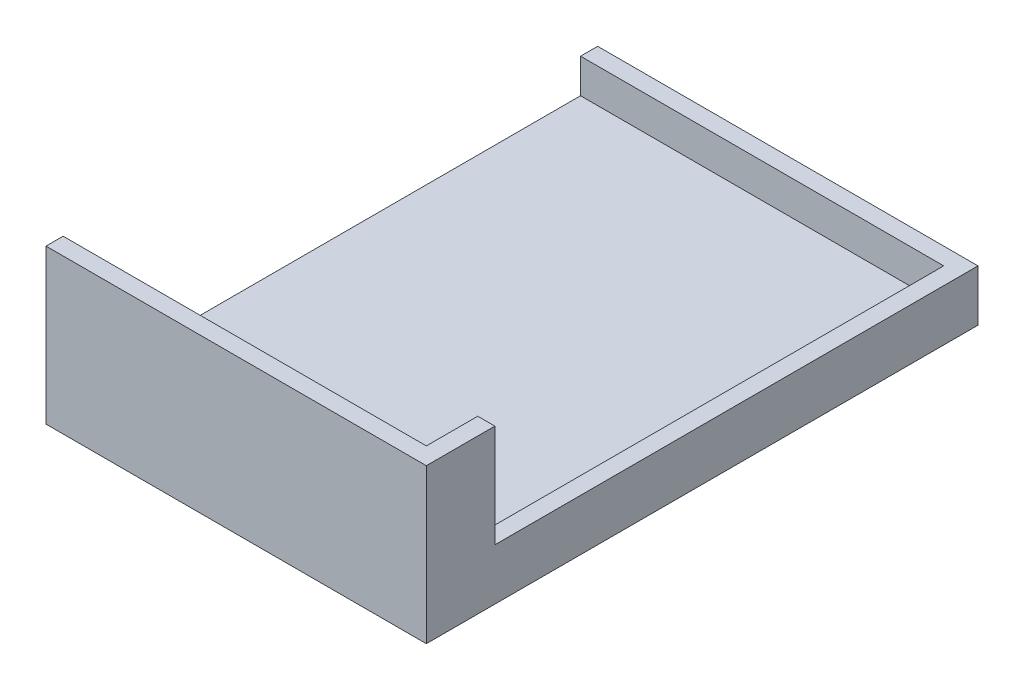
ISO-10303-21;
HEADER;
FILE_DESCRIPTION(('STEP AP214'),'2;1');
FILE_NAME('part.step','',(''),(''),'','','');
FILE_SCHEMA(('AUTOMOTIVE_DESIGN { 1 0 10303 214 1 1 1 1 }'));
ENDSEC;
DATA;
#1=APPLICATION_CONTEXT('core data for automotive mechanical design processes');
#2=APPLICATION_PROTOCOL_DEFINITION('international standard','automotive_design',2000,#1);
#3=PRODUCT_CONTEXT('',#1,'mechanical');
#4=PRODUCT('Part','Part','',(#3));
#5=PRODUCT_RELATED_PRODUCT_CATEGORY('part','',(#4));
#6=PRODUCT_DEFINITION_FORMATION('','',#4);
#7=PRODUCT_DEFINITION_CONTEXT('part definition',#1,'design');
#8=PRODUCT_DEFINITION('design','',#6,#7);
#9=PRODUCT_DEFINITION_SHAPE('','',#8);
#10=(LENGTH_UNIT() NAMED_UNIT(*) SI_UNIT(.MILLI.,.METRE.));
#11=(NAMED_UNIT(*) PLANE_ANGLE_UNIT() SI_UNIT($,.RADIAN.));
#12=(NAMED_UNIT(*) SI_UNIT($,.STERADIAN.) SOLID_ANGLE_UNIT());
#13=UNCERTAINTY_MEASURE_WITH_UNIT(LENGTH_MEASURE(1.E-05),#10,'distance_accuracy_value','');
#14=(GEOMETRIC_REPRESENTATION_CONTEXT(3) GLOBAL_UNCERTAINTY_ASSIGNED_CONTEXT((#13)) GLOBAL_UNIT_ASSIGNED_CONTEXT((#10,
#11,#12)) REPRESENTATION_CONTEXT('',''));
#15=CARTESIAN_POINT('',(0.,0.,0.));
#16=DIRECTION('',(0.,0.,1.));
#17=DIRECTION('',(1.,0.,0.));
#18=AXIS2_PLACEMENT_3D('',#15,#16,#17);
#19=CARTESIAN_POINT('',(0.,28.575,0.));
#20=DIRECTION('',(0.,-1.,0.));
#21=DIRECTION('',(0.,0.,-1.));
#22=AXIS2_PLACEMENT_3D('',#19,#20,#21);
#23=PLANE('',#22);
#24=DIRECTION('',(0.,0.,-1.));
#25=VECTOR('',#24,1.);
#26=CARTESIAN_POINT('',(35.675,28.575,51.06));
#27=LINE('',#26,#25);
#28=CARTESIAN_POINT('',(35.675,28.575,51.06));
#29=VERTEX_POINT('',#28);
#30=CARTESIAN_POINT('',(35.675,28.575,38.36));
#31=VERTEX_POINT('',#30);
#32=EDGE_CURVE('E97',#29,#31,#27,.T.);
#33=ORIENTED_EDGE('',*,*,#32,.T.);
#34=DIRECTION('',(1.,0.,0.));
#35=VECTOR('',#34,1.);
#36=CARTESIAN_POINT('',(-59.0391649787128,28.575,38.36));
#37=LINE('',#36,#35);
#38=CARTESIAN_POINT('',(32.5,28.575,38.36));
#39=VERTEX_POINT('',#38);
#40=EDGE_CURVE('E194',#39,#31,#37,.T.);
#41=ORIENTED_EDGE('',*,*,#40,.F.);
#42=DIRECTION('',(0.,0.,-1.));
#43=VECTOR('',#42,1.);
#44=CARTESIAN_POINT('',(32.5,28.575,0.));
#45=LINE('',#44,#43);
#46=CARTESIAN_POINT('',(32.5,28.575,47.885));
#47=VERTEX_POINT('',#46);
#48=EDGE_CURVE('E182',#47,#39,#45,.T.);
#49=ORIENTED_EDGE('',*,*,#48,.F.);
#50=DIRECTION('',(1.,0.,0.));
#51=VECTOR('',#50,1.);
#52=CARTESIAN_POINT('',(0.,28.575,47.885));
#53=LINE('',#52,#51);
#54=CARTESIAN_POINT('',(-34.81,28.575,47.885));
#55=VERTEX_POINT('',#54);
#56=EDGE_CURVE('E174',#55,#47,#53,.T.);
#57=ORIENTED_EDGE('',*,*,#56,.F.);
#58=DIRECTION('',(0.,0.,1.));
#59=VECTOR('',#58,1.);
#60=CARTESIAN_POINT('',(-34.81,28.575,51.06));
#61=LINE('',#60,#59);
#62=CARTESIAN_POINT('',(-34.81,28.575,51.06));
#63=VERTEX_POINT('',#62);
#64=EDGE_CURVE('E211',#55,#63,#61,.T.);
#65=ORIENTED_EDGE('',*,*,#64,.T.);
#66=DIRECTION('',(1.,0.,0.));
#67=VECTOR('',#66,1.);
#68=CARTESIAN_POINT('',(-34.81,28.575,51.06));
#69=LINE('',#68,#67);
#70=EDGE_CURVE('E68',#63,#29,#69,.T.);
#71=ORIENTED_EDGE('',*,*,#70,.T.);
#72=EDGE_LOOP('',(#33,#41,#49,#57,#65,#71));
#73=FACE_BOUND('',#72,.T.);
#74=ADVANCED_FACE('F43',(#73),#23,.F.);
#75=CARTESIAN_POINT('',(35.675,28.575,51.06));
#76=DIRECTION('',(-1.,0.,0.));
#77=DIRECTION('',(0.,0.,1.));
#78=AXIS2_PLACEMENT_3D('',#75,#76,#77);
#79=PLANE('',#78);
#80=DIRECTION('',(0.,-1.,0.));
#81=VECTOR('',#80,1.);
#82=CARTESIAN_POINT('',(35.675,28.575,-51.175));
#83=LINE('',#82,#81);
#84=CARTESIAN_POINT('',(35.675,9.525,-51.175));
#85=VERTEX_POINT('',#84);
#86=CARTESIAN_POINT('',(35.675,0.,-51.175));
#87=VERTEX_POINT('',#86);
#88=EDGE_CURVE('E11',#85,#87,#83,.T.);
#89=ORIENTED_EDGE('',*,*,#88,.F.);
#90=DIRECTION('',(0.,0.,-1.));
#91=VECTOR('',#90,1.);
#92=CARTESIAN_POINT('',(35.675,9.525,38.36));
#93=LINE('',#92,#91);
#94=CARTESIAN_POINT('',(35.675,9.525,38.36));
#95=VERTEX_POINT('',#94);
#96=EDGE_CURVE('E144',#95,#85,#93,.T.);
#97=ORIENTED_EDGE('',*,*,#96,.F.);
#98=DIRECTION('',(0.,-1.,0.));
#99=VECTOR('',#98,1.);
#100=CARTESIAN_POINT('',(35.675,28.575,38.36));
#101=LINE('',#100,#99);
#102=EDGE_CURVE('E239',#31,#95,#101,.T.);
#103=ORIENTED_EDGE('',*,*,#102,.F.);
#104=ORIENTED_EDGE('',*,*,#32,.F.);
#105=DIRECTION('',(0.,-1.,0.));
#106=VECTOR('',#105,1.);
#107=CARTESIAN_POINT('',(35.675,28.575,51.06));
#108=LINE('',#107,#106);
#109=CARTESIAN_POINT('',(35.675,0.,51.06));
#110=VERTEX_POINT('',#109);
#111=EDGE_CURVE('E89',#29,#110,#108,.T.);
#112=ORIENTED_EDGE('',*,*,#111,.T.);
#113=DIRECTION('',(0.,0.,-1.));
#114=VECTOR('',#113,1.);
#115=CARTESIAN_POINT('',(35.675,0.,51.06));
#116=LINE('',#115,#114);
#117=EDGE_CURVE('E103',#110,#87,#116,.T.);
#118=ORIENTED_EDGE('',*,*,#117,.T.);
#119=EDGE_LOOP('',(#89,#97,#103,#104,#112,#118));
#120=FACE_BOUND('',#119,.T.);
#121=ADVANCED_FACE('F45',(#120),#79,.F.);
#122=CARTESIAN_POINT('',(-34.81,28.575,-51.175));
#123=DIRECTION('',(0.,0.,1.));
#124=DIRECTION('',(1.,0.,0.));
#125=AXIS2_PLACEMENT_3D('',#122,#123,#124);
#126=PLANE('',#125);
#127=DIRECTION('',(0.,-1.,0.));
#128=VECTOR('',#127,1.);
#129=CARTESIAN_POINT('',(-34.81,28.575,-51.175));
#130=LINE('',#129,#128);
#131=CARTESIAN_POINT('',(-34.81,9.525,-51.175));
#132=VERTEX_POINT('',#131);
#133=CARTESIAN_POINT('',(-34.81,0.,-51.175));
#134=VERTEX_POINT('',#133);
#135=EDGE_CURVE('E52',#132,#134,#130,.T.);
#136=ORIENTED_EDGE('',*,*,#135,.F.);
#137=DIRECTION('',(1.,0.,0.));
#138=VECTOR('',#137,1.);
#139=CARTESIAN_POINT('',(-59.0391649787128,9.525,-51.175));
#140=LINE('',#139,#138);
#141=EDGE_CURVE('E140',#132,#85,#140,.T.);
#142=ORIENTED_EDGE('',*,*,#141,.T.);
#143=ORIENTED_EDGE('',*,*,#88,.T.);
#144=DIRECTION('',(-1.,0.,0.));
#145=VECTOR('',#144,1.);
#146=CARTESIAN_POINT('',(-34.81,0.,-51.175));
#147=LINE('',#146,#145);
#148=EDGE_CURVE('E110',#87,#134,#147,.T.);
#149=ORIENTED_EDGE('',*,*,#148,.T.);
#150=EDGE_LOOP('',(#136,#142,#143,#149));
#151=FACE_BOUND('',#150,.T.);
#152=ADVANCED_FACE('F137',(#151),#126,.F.);
#153=CARTESIAN_POINT('',(-34.81,28.575,51.06));
#154=DIRECTION('',(1.,0.,0.));
#155=DIRECTION('',(0.,0.,-1.));
#156=AXIS2_PLACEMENT_3D('',#153,#154,#155);
#157=PLANE('',#156);
#158=DIRECTION('',(0.,-1.,0.));
#159=VECTOR('',#158,1.);
#160=CARTESIAN_POINT('',(-34.81,28.575,-48.));
#161=LINE('',#160,#159);
#162=CARTESIAN_POINT('',(-34.81,9.525,-48.));
#163=VERTEX_POINT('',#162);
#164=CARTESIAN_POINT('',(-34.81,3.175,-48.));
#165=VERTEX_POINT('',#164);
#166=EDGE_CURVE('E118',#163,#165,#161,.T.);
#167=ORIENTED_EDGE('',*,*,#166,.F.);
#168=DIRECTION('',(0.,0.,-1.));
#169=VECTOR('',#168,1.);
#170=CARTESIAN_POINT('',(-34.81,9.525,21.9538319179157));
#171=LINE('',#170,#169);
#172=EDGE_CURVE('E134',#163,#132,#171,.T.);
#173=ORIENTED_EDGE('',*,*,#172,.T.);
#174=ORIENTED_EDGE('',*,*,#135,.T.);
#175=DIRECTION('',(0.,0.,1.));
#176=VECTOR('',#175,1.);
#177=CARTESIAN_POINT('',(-34.81,0.,51.06));
#178=LINE('',#177,#176);
#179=CARTESIAN_POINT('',(-34.81,0.,51.06));
#180=VERTEX_POINT('',#179);
#181=EDGE_CURVE('E98',#134,#180,#178,.T.);
#182=ORIENTED_EDGE('',*,*,#181,.T.);
#183=DIRECTION('',(0.,-1.,0.));
#184=VECTOR('',#183,1.);
#185=CARTESIAN_POINT('',(-34.81,28.575,51.06));
#186=LINE('',#185,#184);
#187=EDGE_CURVE('E92',#63,#180,#186,.T.);
#188=ORIENTED_EDGE('',*,*,#187,.F.);
#189=ORIENTED_EDGE('',*,*,#64,.F.);
#190=DIRECTION('',(0.,-1.,0.));
#191=VECTOR('',#190,1.);
#192=CARTESIAN_POINT('',(-34.81,28.575,47.885));
#193=LINE('',#192,#191);
#194=CARTESIAN_POINT('',(-34.81,3.175,47.885));
#195=VERTEX_POINT('',#194);
#196=EDGE_CURVE('E59',#55,#195,#193,.T.);
#197=ORIENTED_EDGE('',*,*,#196,.T.);
#198=DIRECTION('',(0.,0.,1.));
#199=VECTOR('',#198,1.);
#200=CARTESIAN_POINT('',(-34.81,3.175,0.));
#201=LINE('',#200,#199);
#202=EDGE_CURVE('E199',#165,#195,#201,.T.);
#203=ORIENTED_EDGE('',*,*,#202,.F.);
#204=EDGE_LOOP('',(#167,#173,#174,#182,#188,#189,#197,#203));
#205=FACE_BOUND('',#204,.T.);
#206=ADVANCED_FACE('F131',(#205),#157,.F.);
#207=CARTESIAN_POINT('',(-34.81,28.575,51.06));
#208=DIRECTION('',(0.,0.,-1.));
#209=DIRECTION('',(-1.,0.,0.));
#210=AXIS2_PLACEMENT_3D('',#207,#208,#209);
#211=PLANE('',#210);
#212=DIRECTION('',(1.,0.,0.));
#213=VECTOR('',#212,1.);
#214=CARTESIAN_POINT('',(-34.81,0.,51.06));
#215=LINE('',#214,#213);
#216=EDGE_CURVE('E86',#180,#110,#215,.T.);
#217=ORIENTED_EDGE('',*,*,#216,.T.);
#218=ORIENTED_EDGE('',*,*,#111,.F.);
#219=ORIENTED_EDGE('',*,*,#70,.F.);
#220=ORIENTED_EDGE('',*,*,#187,.T.);
#221=EDGE_LOOP('',(#217,#218,#219,#220));
#222=FACE_BOUND('',#221,.T.);
#223=ADVANCED_FACE('F88',(#222),#211,.F.);
#224=CARTESIAN_POINT('',(0.,0.,0.));
#225=DIRECTION('',(0.,-1.,0.));
#226=DIRECTION('',(0.,0.,-1.));
#227=AXIS2_PLACEMENT_3D('',#224,#225,#226);
#228=PLANE('',#227);
#229=ORIENTED_EDGE('',*,*,#117,.F.);
#230=ORIENTED_EDGE('',*,*,#216,.F.);
#231=ORIENTED_EDGE('',*,*,#181,.F.);
#232=ORIENTED_EDGE('',*,*,#148,.F.);
#233=EDGE_LOOP('',(#229,#230,#231,#232));
#234=FACE_BOUND('',#233,.T.);
#235=ADVANCED_FACE('F108',(#234),#228,.T.);
#236=CARTESIAN_POINT('',(32.5,28.575,51.06));
#237=DIRECTION('',(-1.,0.,0.));
#238=DIRECTION('',(0.,0.,1.));
#239=AXIS2_PLACEMENT_3D('',#236,#237,#238);
#240=PLANE('',#239);
#241=DIRECTION('',(0.,0.,-1.));
#242=VECTOR('',#241,1.);
#243=CARTESIAN_POINT('',(32.5,9.525,38.36));
#244=LINE('',#243,#242);
#245=CARTESIAN_POINT('',(32.5,9.525,38.36));
#246=VERTEX_POINT('',#245);
#247=CARTESIAN_POINT('',(32.5,9.525,-48.));
#248=VERTEX_POINT('',#247);
#249=EDGE_CURVE('E232',#246,#248,#244,.T.);
#250=ORIENTED_EDGE('',*,*,#249,.T.);
#251=DIRECTION('',(0.,-1.,0.));
#252=VECTOR('',#251,1.);
#253=CARTESIAN_POINT('',(32.5,28.575,-48.));
#254=LINE('',#253,#252);
#255=CARTESIAN_POINT('',(32.5,3.175,-48.));
#256=VERTEX_POINT('',#255);
#257=EDGE_CURVE('E112',#248,#256,#254,.T.);
#258=ORIENTED_EDGE('',*,*,#257,.T.);
#259=DIRECTION('',(0.,0.,-1.));
#260=VECTOR('',#259,1.);
#261=CARTESIAN_POINT('',(32.5,3.175,0.));
#262=LINE('',#261,#260);
#263=CARTESIAN_POINT('',(32.5,3.175,47.885));
#264=VERTEX_POINT('',#263);
#265=EDGE_CURVE('E190',#264,#256,#262,.T.);
#266=ORIENTED_EDGE('',*,*,#265,.F.);
#267=DIRECTION('',(0.,-1.,0.));
#268=VECTOR('',#267,1.);
#269=CARTESIAN_POINT('',(32.5,28.575,47.885));
#270=LINE('',#269,#268);
#271=EDGE_CURVE('E177',#47,#264,#270,.T.);
#272=ORIENTED_EDGE('',*,*,#271,.F.);
#273=ORIENTED_EDGE('',*,*,#48,.T.);
#274=DIRECTION('',(0.,-1.,0.));
#275=VECTOR('',#274,1.);
#276=CARTESIAN_POINT('',(32.5,28.575,38.36));
#277=LINE('',#276,#275);
#278=EDGE_CURVE('E229',#39,#246,#277,.T.);
#279=ORIENTED_EDGE('',*,*,#278,.T.);
#280=EDGE_LOOP('',(#250,#258,#266,#272,#273,#279));
#281=FACE_BOUND('',#280,.T.);
#282=ADVANCED_FACE('F187',(#281),#240,.T.);
#283=CARTESIAN_POINT('',(-34.81,28.575,-48.));
#284=DIRECTION('',(0.,0.,1.));
#285=DIRECTION('',(1.,0.,0.));
#286=AXIS2_PLACEMENT_3D('',#283,#284,#285);
#287=PLANE('',#286);
#288=DIRECTION('',(-1.,0.,0.));
#289=VECTOR('',#288,1.);
#290=CARTESIAN_POINT('',(-34.81,9.525,-48.));
#291=LINE('',#290,#289);
#292=EDGE_CURVE('E247',#248,#163,#291,.T.);
#293=ORIENTED_EDGE('',*,*,#292,.T.);
#294=ORIENTED_EDGE('',*,*,#166,.T.);
#295=DIRECTION('',(-1.,0.,0.));
#296=VECTOR('',#295,1.);
#297=CARTESIAN_POINT('',(0.,3.175,-48.));
#298=LINE('',#297,#296);
#299=EDGE_CURVE('E207',#256,#165,#298,.T.);
#300=ORIENTED_EDGE('',*,*,#299,.F.);
#301=ORIENTED_EDGE('',*,*,#257,.F.);
#302=EDGE_LOOP('',(#293,#294,#300,#301));
#303=FACE_BOUND('',#302,.T.);
#304=ADVANCED_FACE('F250',(#303),#287,.T.);
#305=CARTESIAN_POINT('',(-34.81,28.575,47.885));
#306=DIRECTION('',(0.,0.,-1.));
#307=DIRECTION('',(-1.,0.,0.));
#308=AXIS2_PLACEMENT_3D('',#305,#306,#307);
#309=PLANE('',#308);
#310=DIRECTION('',(1.,0.,0.));
#311=VECTOR('',#310,1.);
#312=CARTESIAN_POINT('',(0.,3.175,47.885));
#313=LINE('',#312,#311);
#314=EDGE_CURVE('E196',#195,#264,#313,.T.);
#315=ORIENTED_EDGE('',*,*,#314,.F.);
#316=ORIENTED_EDGE('',*,*,#196,.F.);
#317=ORIENTED_EDGE('',*,*,#56,.T.);
#318=ORIENTED_EDGE('',*,*,#271,.T.);
#319=EDGE_LOOP('',(#315,#316,#317,#318));
#320=FACE_BOUND('',#319,.T.);
#321=ADVANCED_FACE('F176',(#320),#309,.T.);
#322=CARTESIAN_POINT('',(0.,3.175,0.));
#323=DIRECTION('',(0.,-1.,0.));
#324=DIRECTION('',(0.,0.,-1.));
#325=AXIS2_PLACEMENT_3D('',#322,#323,#324);
#326=PLANE('',#325);
#327=ORIENTED_EDGE('',*,*,#265,.T.);
#328=ORIENTED_EDGE('',*,*,#299,.T.);
#329=ORIENTED_EDGE('',*,*,#202,.T.);
#330=ORIENTED_EDGE('',*,*,#314,.T.);
#331=EDGE_LOOP('',(#327,#328,#329,#330));
#332=FACE_BOUND('',#331,.T.);
#333=ADVANCED_FACE('F218',(#332),#326,.F.);
#334=CARTESIAN_POINT('',(-59.0391649787128,9.525,38.36));
#335=DIRECTION('',(0.,-1.,0.));
#336=DIRECTION('',(0.,0.,-1.));
#337=AXIS2_PLACEMENT_3D('',#334,#335,#336);
#338=PLANE('',#337);
#339=DIRECTION('',(1.,0.,0.));
#340=VECTOR('',#339,1.);
#341=CARTESIAN_POINT('',(-59.0391649787128,9.525,38.36));
#342=LINE('',#341,#340);
#343=EDGE_CURVE('E224',#246,#95,#342,.T.);
#344=ORIENTED_EDGE('',*,*,#343,.T.);
#345=ORIENTED_EDGE('',*,*,#96,.T.);
#346=ORIENTED_EDGE('',*,*,#141,.F.);
#347=ORIENTED_EDGE('',*,*,#172,.F.);
#348=ORIENTED_EDGE('',*,*,#292,.F.);
#349=ORIENTED_EDGE('',*,*,#249,.F.);
#350=EDGE_LOOP('',(#344,#345,#346,#347,#348,#349));
#351=FACE_BOUND('',#350,.T.);
#352=ADVANCED_FACE('F251',(#351),#338,.F.);
#353=CARTESIAN_POINT('',(-59.0391649787128,28.575,38.36));
#354=DIRECTION('',(0.,0.,1.));
#355=DIRECTION('',(1.,0.,0.));
#356=AXIS2_PLACEMENT_3D('',#353,#354,#355);
#357=PLANE('',#356);
#358=ORIENTED_EDGE('',*,*,#40,.T.);
#359=ORIENTED_EDGE('',*,*,#102,.T.);
#360=ORIENTED_EDGE('',*,*,#343,.F.);
#361=ORIENTED_EDGE('',*,*,#278,.F.);
#362=EDGE_LOOP('',(#358,#359,#360,#361));
#363=FACE_BOUND('',#362,.T.);
#364=ADVANCED_FACE('F254',(#363),#357,.F.);
#365=CLOSED_SHELL('',(#74,#121,#152,#206,#223,#235,#282,#304,#321,#333,#352,#364));
#366=MANIFOLD_SOLID_BREP('B2',#365);
#367=ADVANCED_BREP_SHAPE_REPRESENTATION('',(#18,#366),#14);
#368=SHAPE_DEFINITION_REPRESENTATION(#9,#367);
ENDSEC;
END-ISO-10303-21;
